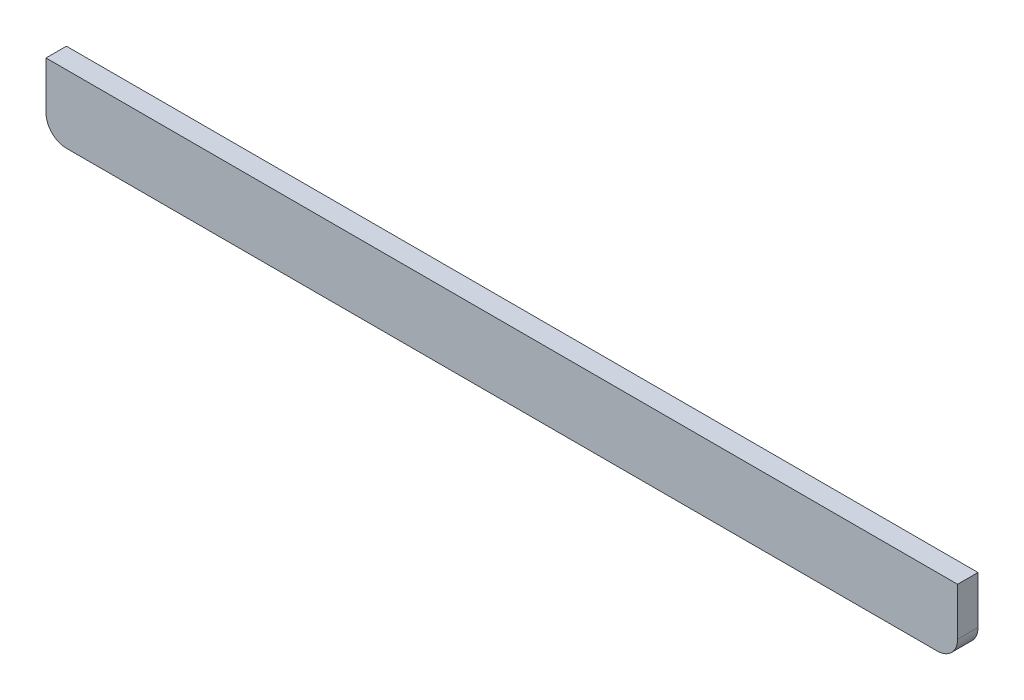
ISO-10303-21;
HEADER;
FILE_DESCRIPTION(('STEP AP214'),'2;1');
FILE_NAME('part.step','',(''),(''),'','','');
FILE_SCHEMA(('AUTOMOTIVE_DESIGN { 1 0 10303 214 1 1 1 1 }'));
ENDSEC;
DATA;
#1=APPLICATION_CONTEXT('core data for automotive mechanical design processes');
#2=APPLICATION_PROTOCOL_DEFINITION('international standard','automotive_design',2000,#1);
#3=PRODUCT_CONTEXT('',#1,'mechanical');
#4=PRODUCT('Part','Part','',(#3));
#5=PRODUCT_RELATED_PRODUCT_CATEGORY('part','',(#4));
#6=PRODUCT_DEFINITION_FORMATION('','',#4);
#7=PRODUCT_DEFINITION_CONTEXT('part definition',#1,'design');
#8=PRODUCT_DEFINITION('design','',#6,#7);
#9=PRODUCT_DEFINITION_SHAPE('','',#8);
#10=(LENGTH_UNIT() NAMED_UNIT(*) SI_UNIT(.MILLI.,.METRE.));
#11=(NAMED_UNIT(*) PLANE_ANGLE_UNIT() SI_UNIT($,.RADIAN.));
#12=(NAMED_UNIT(*) SI_UNIT($,.STERADIAN.) SOLID_ANGLE_UNIT());
#13=UNCERTAINTY_MEASURE_WITH_UNIT(LENGTH_MEASURE(1.E-05),#10,'distance_accuracy_value','');
#14=(GEOMETRIC_REPRESENTATION_CONTEXT(3) GLOBAL_UNCERTAINTY_ASSIGNED_CONTEXT((#13)) GLOBAL_UNIT_ASSIGNED_CONTEXT((#10,
#11,#12)) REPRESENTATION_CONTEXT('',''));
#15=CARTESIAN_POINT('',(0.,0.,0.));
#16=DIRECTION('',(0.,0.,1.));
#17=DIRECTION('',(1.,0.,0.));
#18=AXIS2_PLACEMENT_3D('',#15,#16,#17);
#19=CARTESIAN_POINT('',(0.,0.,3.));
#20=DIRECTION('',(-1.,0.,0.));
#21=DIRECTION('',(0.,0.,1.));
#22=AXIS2_PLACEMENT_3D('',#19,#20,#21);
#23=PLANE('',#22);
#24=DIRECTION('',(0.,1.,0.));
#25=VECTOR('',#24,1.);
#26=CARTESIAN_POINT('',(0.,0.,0.));
#27=LINE('',#26,#25);
#28=CARTESIAN_POINT('',(0.,3.,0.));
#29=VERTEX_POINT('',#28);
#30=CARTESIAN_POINT('',(0.,10.,0.));
#31=VERTEX_POINT('',#30);
#32=EDGE_CURVE('E119',#29,#31,#27,.T.);
#33=ORIENTED_EDGE('',*,*,#32,.F.);
#34=DIRECTION('',(0.,0.,-1.));
#35=VECTOR('',#34,1.);
#36=CARTESIAN_POINT('',(0.,3.,3.));
#37=LINE('',#36,#35);
#38=CARTESIAN_POINT('',(0.,3.,3.));
#39=VERTEX_POINT('',#38);
#40=EDGE_CURVE('E11',#29,#39,#37,.F.);
#41=ORIENTED_EDGE('',*,*,#40,.T.);
#42=DIRECTION('',(0.,1.,0.));
#43=VECTOR('',#42,1.);
#44=CARTESIAN_POINT('',(0.,0.,3.));
#45=LINE('',#44,#43);
#46=CARTESIAN_POINT('',(0.,10.,3.));
#47=VERTEX_POINT('',#46);
#48=EDGE_CURVE('E92',#39,#47,#45,.T.);
#49=ORIENTED_EDGE('',*,*,#48,.T.);
#50=DIRECTION('',(0.,0.,-1.));
#51=VECTOR('',#50,1.);
#52=CARTESIAN_POINT('',(0.,10.,3.));
#53=LINE('',#52,#51);
#54=EDGE_CURVE('E94',#47,#31,#53,.T.);
#55=ORIENTED_EDGE('',*,*,#54,.T.);
#56=EDGE_LOOP('',(#33,#41,#49,#55));
#57=FACE_BOUND('',#56,.T.);
#58=ADVANCED_FACE('F40',(#57),#23,.T.);
#59=CARTESIAN_POINT('',(0.,0.,3.));
#60=DIRECTION('',(0.,1.,0.));
#61=DIRECTION('',(0.,0.,1.));
#62=AXIS2_PLACEMENT_3D('',#59,#60,#61);
#63=PLANE('',#62);
#64=DIRECTION('',(1.,0.,0.));
#65=VECTOR('',#64,1.);
#66=CARTESIAN_POINT('',(0.,0.,0.));
#67=LINE('',#66,#65);
#68=CARTESIAN_POINT('',(3.,0.,0.));
#69=VERTEX_POINT('',#68);
#70=CARTESIAN_POINT('',(131.,0.,0.));
#71=VERTEX_POINT('',#70);
#72=EDGE_CURVE('E100',#69,#71,#67,.T.);
#73=ORIENTED_EDGE('',*,*,#72,.T.);
#74=DIRECTION('',(0.,0.,-1.));
#75=VECTOR('',#74,1.);
#76=CARTESIAN_POINT('',(131.,0.,3.));
#77=LINE('',#76,#75);
#78=CARTESIAN_POINT('',(131.,0.,3.));
#79=VERTEX_POINT('',#78);
#80=EDGE_CURVE('E61',#71,#79,#77,.F.);
#81=ORIENTED_EDGE('',*,*,#80,.T.);
#82=DIRECTION('',(1.,0.,0.));
#83=VECTOR('',#82,1.);
#84=CARTESIAN_POINT('',(0.,0.,3.));
#85=LINE('',#84,#83);
#86=CARTESIAN_POINT('',(3.,0.,3.));
#87=VERTEX_POINT('',#86);
#88=EDGE_CURVE('E109',#87,#79,#85,.T.);
#89=ORIENTED_EDGE('',*,*,#88,.F.);
#90=DIRECTION('',(0.,0.,-1.));
#91=VECTOR('',#90,1.);
#92=CARTESIAN_POINT('',(3.,0.,0.));
#93=LINE('',#92,#91);
#94=EDGE_CURVE('E133',#87,#69,#93,.T.);
#95=ORIENTED_EDGE('',*,*,#94,.T.);
#96=EDGE_LOOP('',(#73,#81,#89,#95));
#97=FACE_BOUND('',#96,.T.);
#98=ADVANCED_FACE('F148',(#97),#63,.F.);
#99=CARTESIAN_POINT('',(134.,0.,3.));
#100=DIRECTION('',(-1.,0.,0.));
#101=DIRECTION('',(0.,0.,1.));
#102=AXIS2_PLACEMENT_3D('',#99,#100,#101);
#103=PLANE('',#102);
#104=DIRECTION('',(0.,1.,0.));
#105=VECTOR('',#104,1.);
#106=CARTESIAN_POINT('',(134.,0.,3.));
#107=LINE('',#106,#105);
#108=CARTESIAN_POINT('',(134.,3.,3.));
#109=VERTEX_POINT('',#108);
#110=CARTESIAN_POINT('',(134.,10.,3.));
#111=VERTEX_POINT('',#110);
#112=EDGE_CURVE('E113',#109,#111,#107,.T.);
#113=ORIENTED_EDGE('',*,*,#112,.F.);
#114=DIRECTION('',(0.,0.,-1.));
#115=VECTOR('',#114,1.);
#116=CARTESIAN_POINT('',(134.,3.,3.));
#117=LINE('',#116,#115);
#118=CARTESIAN_POINT('',(134.,3.,0.));
#119=VERTEX_POINT('',#118);
#120=EDGE_CURVE('E125',#109,#119,#117,.T.);
#121=ORIENTED_EDGE('',*,*,#120,.T.);
#122=DIRECTION('',(0.,1.,0.));
#123=VECTOR('',#122,1.);
#124=CARTESIAN_POINT('',(134.,0.,0.));
#125=LINE('',#124,#123);
#126=CARTESIAN_POINT('',(134.,10.,0.));
#127=VERTEX_POINT('',#126);
#128=EDGE_CURVE('E122',#119,#127,#125,.T.);
#129=ORIENTED_EDGE('',*,*,#128,.T.);
#130=DIRECTION('',(0.,0.,-1.));
#131=VECTOR('',#130,1.);
#132=CARTESIAN_POINT('',(134.,10.,3.));
#133=LINE('',#132,#131);
#134=EDGE_CURVE('E108',#111,#127,#133,.T.);
#135=ORIENTED_EDGE('',*,*,#134,.F.);
#136=EDGE_LOOP('',(#113,#121,#129,#135));
#137=FACE_BOUND('',#136,.T.);
#138=ADVANCED_FACE('F142',(#137),#103,.F.);
#139=CARTESIAN_POINT('',(0.,10.,3.));
#140=DIRECTION('',(0.,1.,0.));
#141=DIRECTION('',(0.,0.,1.));
#142=AXIS2_PLACEMENT_3D('',#139,#140,#141);
#143=PLANE('',#142);
#144=DIRECTION('',(1.,0.,0.));
#145=VECTOR('',#144,1.);
#146=CARTESIAN_POINT('',(0.,10.,0.));
#147=LINE('',#146,#145);
#148=EDGE_CURVE('E107',#31,#127,#147,.T.);
#149=ORIENTED_EDGE('',*,*,#148,.F.);
#150=ORIENTED_EDGE('',*,*,#54,.F.);
#151=DIRECTION('',(1.,0.,0.));
#152=VECTOR('',#151,1.);
#153=CARTESIAN_POINT('',(0.,10.,3.));
#154=LINE('',#153,#152);
#155=EDGE_CURVE('E99',#47,#111,#154,.T.);
#156=ORIENTED_EDGE('',*,*,#155,.T.);
#157=ORIENTED_EDGE('',*,*,#134,.T.);
#158=EDGE_LOOP('',(#149,#150,#156,#157));
#159=FACE_BOUND('',#158,.T.);
#160=ADVANCED_FACE('F104',(#159),#143,.T.);
#161=CARTESIAN_POINT('',(0.,0.,3.));
#162=DIRECTION('',(0.,0.,-1.));
#163=DIRECTION('',(-1.,0.,0.));
#164=AXIS2_PLACEMENT_3D('',#161,#162,#163);
#165=PLANE('',#164);
#166=ORIENTED_EDGE('',*,*,#88,.T.);
#167=CARTESIAN_POINT('',(131.,3.,3.));
#168=DIRECTION('',(0.,0.,-1.));
#169=DIRECTION('',(-1.,0.,0.));
#170=AXIS2_PLACEMENT_3D('',#167,#168,#169);
#171=CIRCLE('',#170,3.);
#172=EDGE_CURVE('E48',#79,#109,#171,.F.);
#173=ORIENTED_EDGE('',*,*,#172,.T.);
#174=ORIENTED_EDGE('',*,*,#112,.T.);
#175=ORIENTED_EDGE('',*,*,#155,.F.);
#176=ORIENTED_EDGE('',*,*,#48,.F.);
#177=CARTESIAN_POINT('',(3.,3.,3.));
#178=DIRECTION('',(0.,0.,-1.));
#179=DIRECTION('',(-1.,0.,0.));
#180=AXIS2_PLACEMENT_3D('',#177,#178,#179);
#181=CIRCLE('',#180,3.);
#182=EDGE_CURVE('E137',#39,#87,#181,.F.);
#183=ORIENTED_EDGE('',*,*,#182,.T.);
#184=EDGE_LOOP('',(#166,#173,#174,#175,#176,#183));
#185=FACE_BOUND('',#184,.T.);
#186=ADVANCED_FACE('F111',(#185),#165,.F.);
#187=CARTESIAN_POINT('',(0.,0.,0.));
#188=DIRECTION('',(0.,0.,-1.));
#189=DIRECTION('',(-1.,0.,0.));
#190=AXIS2_PLACEMENT_3D('',#187,#188,#189);
#191=PLANE('',#190);
#192=ORIENTED_EDGE('',*,*,#128,.F.);
#193=CARTESIAN_POINT('',(131.,3.,0.));
#194=DIRECTION('',(0.,0.,-1.));
#195=DIRECTION('',(-1.,0.,0.));
#196=AXIS2_PLACEMENT_3D('',#193,#194,#195);
#197=CIRCLE('',#196,3.);
#198=EDGE_CURVE('E131',#119,#71,#197,.T.);
#199=ORIENTED_EDGE('',*,*,#198,.T.);
#200=ORIENTED_EDGE('',*,*,#72,.F.);
#201=CARTESIAN_POINT('',(3.,3.,0.));
#202=DIRECTION('',(0.,0.,-1.));
#203=DIRECTION('',(-1.,0.,0.));
#204=AXIS2_PLACEMENT_3D('',#201,#202,#203);
#205=CIRCLE('',#204,3.);
#206=EDGE_CURVE('E129',#69,#29,#205,.T.);
#207=ORIENTED_EDGE('',*,*,#206,.T.);
#208=ORIENTED_EDGE('',*,*,#32,.T.);
#209=ORIENTED_EDGE('',*,*,#148,.T.);
#210=EDGE_LOOP('',(#192,#199,#200,#207,#208,#209));
#211=FACE_BOUND('',#210,.T.);
#212=ADVANCED_FACE('F147',(#211),#191,.T.);
#213=CARTESIAN_POINT('',(131.,3.,3.));
#214=DIRECTION('',(0.,0.,-1.));
#215=DIRECTION('',(-1.,0.,0.));
#216=AXIS2_PLACEMENT_3D('',#213,#214,#215);
#217=CYLINDRICAL_SURFACE('',#216,3.);
#218=ORIENTED_EDGE('',*,*,#172,.F.);
#219=ORIENTED_EDGE('',*,*,#80,.F.);
#220=ORIENTED_EDGE('',*,*,#198,.F.);
#221=ORIENTED_EDGE('',*,*,#120,.F.);
#222=EDGE_LOOP('',(#218,#219,#220,#221));
#223=FACE_BOUND('',#222,.T.);
#224=ADVANCED_FACE('F144',(#223),#217,.T.);
#225=CARTESIAN_POINT('',(3.,3.,3.));
#226=DIRECTION('',(0.,0.,1.));
#227=DIRECTION('',(1.,0.,0.));
#228=AXIS2_PLACEMENT_3D('',#225,#226,#227);
#229=CYLINDRICAL_SURFACE('',#228,3.);
#230=ORIENTED_EDGE('',*,*,#182,.F.);
#231=ORIENTED_EDGE('',*,*,#40,.F.);
#232=ORIENTED_EDGE('',*,*,#206,.F.);
#233=ORIENTED_EDGE('',*,*,#94,.F.);
#234=EDGE_LOOP('',(#230,#231,#232,#233));
#235=FACE_BOUND('',#234,.T.);
#236=ADVANCED_FACE('F42',(#235),#229,.T.);
#237=CLOSED_SHELL('',(#58,#98,#138,#160,#186,#212,#224,#236));
#238=MANIFOLD_SOLID_BREP('B2',#237);
#239=ADVANCED_BREP_SHAPE_REPRESENTATION('',(#18,#238),#14);
#240=SHAPE_DEFINITION_REPRESENTATION(#9,#239);
ENDSEC;
END-ISO-10303-21;
